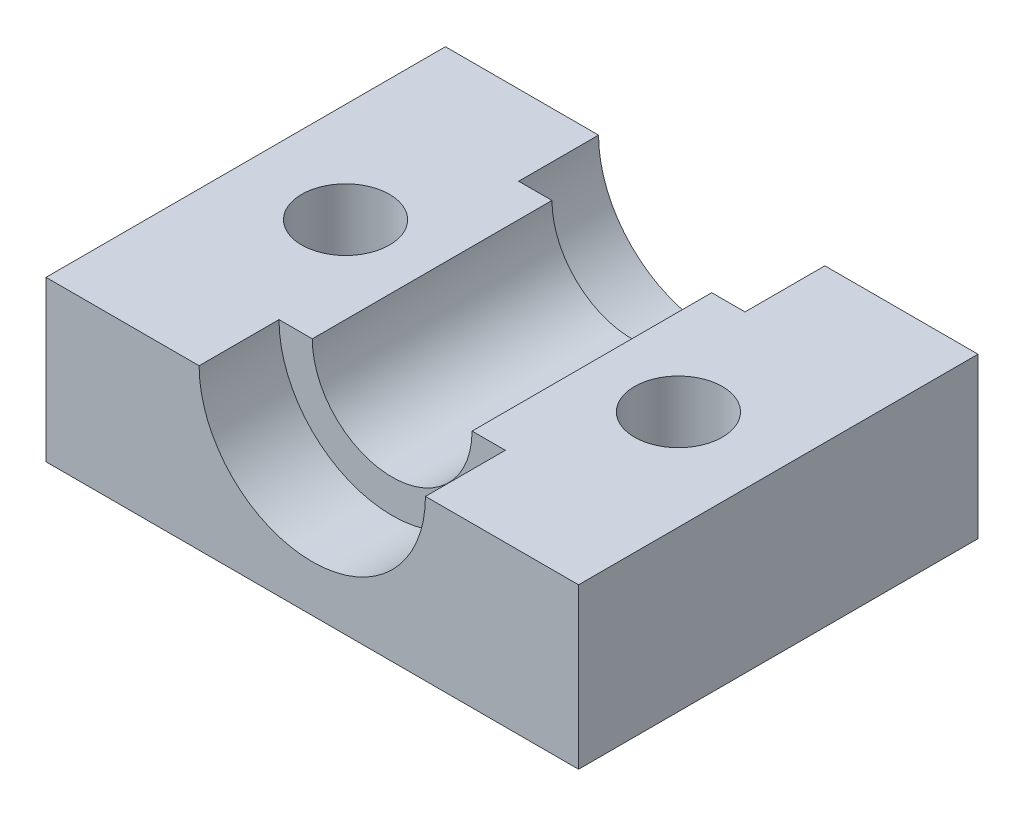
ISO-10303-21;
HEADER;
FILE_DESCRIPTION(('STEP AP214'),'2;1');
FILE_NAME('part.step','',(''),(''),'','','');
FILE_SCHEMA(('AUTOMOTIVE_DESIGN { 1 0 10303 214 1 1 1 1 }'));
ENDSEC;
DATA;
#1=APPLICATION_CONTEXT('core data for automotive mechanical design processes');
#2=APPLICATION_PROTOCOL_DEFINITION('international standard','automotive_design',2000,#1);
#3=PRODUCT_CONTEXT('',#1,'mechanical');
#4=PRODUCT('Part','Part','',(#3));
#5=PRODUCT_RELATED_PRODUCT_CATEGORY('part','',(#4));
#6=PRODUCT_DEFINITION_FORMATION('','',#4);
#7=PRODUCT_DEFINITION_CONTEXT('part definition',#1,'design');
#8=PRODUCT_DEFINITION('design','',#6,#7);
#9=PRODUCT_DEFINITION_SHAPE('','',#8);
#10=(LENGTH_UNIT() NAMED_UNIT(*) SI_UNIT(.MILLI.,.METRE.));
#11=(NAMED_UNIT(*) PLANE_ANGLE_UNIT() SI_UNIT($,.RADIAN.));
#12=(NAMED_UNIT(*) SI_UNIT($,.STERADIAN.) SOLID_ANGLE_UNIT());
#13=UNCERTAINTY_MEASURE_WITH_UNIT(LENGTH_MEASURE(1.E-05),#10,'distance_accuracy_value','');
#14=(GEOMETRIC_REPRESENTATION_CONTEXT(3) GLOBAL_UNCERTAINTY_ASSIGNED_CONTEXT((#13)) GLOBAL_UNIT_ASSIGNED_CONTEXT((#10,
#11,#12)) REPRESENTATION_CONTEXT('',''));
#15=CARTESIAN_POINT('',(0.,0.,0.));
#16=DIRECTION('',(0.,0.,1.));
#17=DIRECTION('',(1.,0.,0.));
#18=AXIS2_PLACEMENT_3D('',#15,#16,#17);
#19=CARTESIAN_POINT('',(20.,12.,-6.));
#20=DIRECTION('',(0.,0.,1.));
#21=DIRECTION('',(1.,0.,0.));
#22=AXIS2_PLACEMENT_3D('',#19,#20,#21);
#23=CYLINDRICAL_SURFACE('',#22,8.5);
#24=DIRECTION('',(0.,0.,1.));
#25=VECTOR('',#24,1.);
#26=CARTESIAN_POINT('',(11.5,12.,-6.));
#27=LINE('',#26,#25);
#28=CARTESIAN_POINT('',(11.5,12.,-6.));
#29=VERTEX_POINT('',#28);
#30=CARTESIAN_POINT('',(11.5,12.,0.));
#31=VERTEX_POINT('',#30);
#32=EDGE_CURVE('E46',#29,#31,#27,.T.);
#33=ORIENTED_EDGE('',*,*,#32,.T.);
#34=CARTESIAN_POINT('',(20.,12.,0.));
#35=DIRECTION('',(0.,0.,1.));
#36=DIRECTION('',(1.,0.,0.));
#37=AXIS2_PLACEMENT_3D('',#34,#35,#36);
#38=CIRCLE('',#37,8.5);
#39=CARTESIAN_POINT('',(28.5,12.,0.));
#40=VERTEX_POINT('',#39);
#41=EDGE_CURVE('E139',#31,#40,#38,.T.);
#42=ORIENTED_EDGE('',*,*,#41,.T.);
#43=DIRECTION('',(0.,0.,1.));
#44=VECTOR('',#43,1.);
#45=CARTESIAN_POINT('',(28.5,12.,-6.));
#46=LINE('',#45,#44);
#47=CARTESIAN_POINT('',(28.5,12.,-6.));
#48=VERTEX_POINT('',#47);
#49=EDGE_CURVE('E186',#48,#40,#46,.T.);
#50=ORIENTED_EDGE('',*,*,#49,.F.);
#51=CARTESIAN_POINT('',(20.,12.,-6.));
#52=DIRECTION('',(0.,0.,-1.));
#53=DIRECTION('',(1.,0.,0.));
#54=AXIS2_PLACEMENT_3D('',#51,#52,#53);
#55=CIRCLE('',#54,8.5);
#56=EDGE_CURVE('E177',#48,#29,#55,.T.);
#57=ORIENTED_EDGE('',*,*,#56,.T.);
#58=EDGE_LOOP('',(#33,#42,#50,#57));
#59=FACE_BOUND('',#58,.T.);
#60=ADVANCED_FACE('F37',(#59),#23,.F.);
#61=CARTESIAN_POINT('',(0.,0.,-6.));
#62=DIRECTION('',(-1.,0.,0.));
#63=DIRECTION('',(0.,0.,1.));
#64=AXIS2_PLACEMENT_3D('',#61,#62,#63);
#65=PLANE('',#64);
#66=DIRECTION('',(0.,0.,1.));
#67=VECTOR('',#66,1.);
#68=CARTESIAN_POINT('',(0.,0.,-6.));
#69=LINE('',#68,#67);
#70=CARTESIAN_POINT('',(0.,0.,-6.));
#71=VERTEX_POINT('',#70);
#72=CARTESIAN_POINT('',(0.,0.,24.));
#73=VERTEX_POINT('',#72);
#74=EDGE_CURVE('E41',#71,#73,#69,.T.);
#75=ORIENTED_EDGE('',*,*,#74,.T.);
#76=DIRECTION('',(0.,-1.,0.));
#77=VECTOR('',#76,1.);
#78=CARTESIAN_POINT('',(0.,0.,24.));
#79=LINE('',#78,#77);
#80=CARTESIAN_POINT('',(0.,12.,24.));
#81=VERTEX_POINT('',#80);
#82=EDGE_CURVE('E128',#81,#73,#79,.T.);
#83=ORIENTED_EDGE('',*,*,#82,.F.);
#84=DIRECTION('',(0.,0.,1.));
#85=VECTOR('',#84,1.);
#86=CARTESIAN_POINT('',(0.,12.,-6.));
#87=LINE('',#86,#85);
#88=CARTESIAN_POINT('',(0.,12.,-6.));
#89=VERTEX_POINT('',#88);
#90=EDGE_CURVE('E11',#89,#81,#87,.T.);
#91=ORIENTED_EDGE('',*,*,#90,.F.);
#92=DIRECTION('',(0.,-1.,0.));
#93=VECTOR('',#92,1.);
#94=CARTESIAN_POINT('',(0.,0.,-6.));
#95=LINE('',#94,#93);
#96=EDGE_CURVE('E166',#89,#71,#95,.T.);
#97=ORIENTED_EDGE('',*,*,#96,.T.);
#98=EDGE_LOOP('',(#75,#83,#91,#97));
#99=FACE_BOUND('',#98,.T.);
#100=ADVANCED_FACE('F39',(#99),#65,.T.);
#101=CARTESIAN_POINT('',(0.,12.,-6.));
#102=DIRECTION('',(0.,1.,0.));
#103=DIRECTION('',(0.,0.,1.));
#104=AXIS2_PLACEMENT_3D('',#101,#102,#103);
#105=PLANE('',#104);
#106=CARTESIAN_POINT('',(7.5,12.,9.));
#107=DIRECTION('',(0.,-1.,0.));
#108=DIRECTION('',(0.,0.,-1.));
#109=AXIS2_PLACEMENT_3D('',#106,#107,#108);
#110=CIRCLE('',#109,3.3);
#111=CARTESIAN_POINT('',(7.5,12.,5.7));
#112=VERTEX_POINT('',#111);
#113=EDGE_CURVE('E226',#112,#112,#110,.T.);
#114=ORIENTED_EDGE('',*,*,#113,.T.);
#115=EDGE_LOOP('',(#114));
#116=FACE_BOUND('',#115,.T.);
#117=ORIENTED_EDGE('',*,*,#90,.T.);
#118=DIRECTION('',(-1.,0.,0.));
#119=VECTOR('',#118,1.);
#120=CARTESIAN_POINT('',(0.,12.,24.));
#121=LINE('',#120,#119);
#122=CARTESIAN_POINT('',(11.5,12.,24.));
#123=VERTEX_POINT('',#122);
#124=EDGE_CURVE('E163',#123,#81,#121,.T.);
#125=ORIENTED_EDGE('',*,*,#124,.F.);
#126=CARTESIAN_POINT('',(11.5,12.,18.));
#127=VERTEX_POINT('',#126);
#128=EDGE_CURVE('E185',#127,#123,#27,.T.);
#129=ORIENTED_EDGE('',*,*,#128,.F.);
#130=DIRECTION('',(-1.,0.,0.));
#131=VECTOR('',#130,1.);
#132=CARTESIAN_POINT('',(11.5,12.,18.));
#133=LINE('',#132,#131);
#134=CARTESIAN_POINT('',(14.,12.,18.));
#135=VERTEX_POINT('',#134);
#136=EDGE_CURVE('E134',#135,#127,#133,.T.);
#137=ORIENTED_EDGE('',*,*,#136,.F.);
#138=DIRECTION('',(0.,0.,-1.));
#139=VECTOR('',#138,1.);
#140=CARTESIAN_POINT('',(14.,12.,18.));
#141=LINE('',#140,#139);
#142=CARTESIAN_POINT('',(14.,12.,0.));
#143=VERTEX_POINT('',#142);
#144=EDGE_CURVE('E129',#135,#143,#141,.T.);
#145=ORIENTED_EDGE('',*,*,#144,.T.);
#146=DIRECTION('',(-1.,0.,0.));
#147=VECTOR('',#146,1.);
#148=CARTESIAN_POINT('',(11.5,12.,0.));
#149=LINE('',#148,#147);
#150=EDGE_CURVE('E146',#143,#31,#149,.T.);
#151=ORIENTED_EDGE('',*,*,#150,.T.);
#152=ORIENTED_EDGE('',*,*,#32,.F.);
#153=DIRECTION('',(-1.,0.,0.));
#154=VECTOR('',#153,1.);
#155=CARTESIAN_POINT('',(0.,12.,-6.));
#156=LINE('',#155,#154);
#157=EDGE_CURVE('E180',#29,#89,#156,.T.);
#158=ORIENTED_EDGE('',*,*,#157,.T.);
#159=EDGE_LOOP('',(#117,#125,#129,#137,#145,#151,#152,#158));
#160=FACE_BOUND('',#159,.T.);
#161=ADVANCED_FACE('F202',(#116,#160),#105,.T.);
#162=CARTESIAN_POINT('',(20.,12.,18.));
#163=DIRECTION('',(0.,0.,1.));
#164=DIRECTION('',(1.,0.,0.));
#165=AXIS2_PLACEMENT_3D('',#162,#163,#164);
#166=CIRCLE('',#165,8.5);
#167=CARTESIAN_POINT('',(28.5,12.,18.));
#168=VERTEX_POINT('',#167);
#169=EDGE_CURVE('E54',#127,#168,#166,.T.);
#170=ORIENTED_EDGE('',*,*,#169,.F.);
#171=ORIENTED_EDGE('',*,*,#128,.T.);
#172=CARTESIAN_POINT('',(20.,12.,24.));
#173=DIRECTION('',(0.,0.,-1.));
#174=DIRECTION('',(1.,0.,0.));
#175=AXIS2_PLACEMENT_3D('',#172,#173,#174);
#176=CIRCLE('',#175,8.5);
#177=CARTESIAN_POINT('',(28.5,12.,24.));
#178=VERTEX_POINT('',#177);
#179=EDGE_CURVE('E160',#178,#123,#176,.T.);
#180=ORIENTED_EDGE('',*,*,#179,.F.);
#181=EDGE_CURVE('E188',#168,#178,#46,.T.);
#182=ORIENTED_EDGE('',*,*,#181,.F.);
#183=EDGE_LOOP('',(#170,#171,#180,#182));
#184=FACE_BOUND('',#183,.T.);
#185=ADVANCED_FACE('F213',(#184),#23,.F.);
#186=CARTESIAN_POINT('',(28.5,12.,-6.));
#187=DIRECTION('',(0.,1.,0.));
#188=DIRECTION('',(-1.,0.,0.));
#189=AXIS2_PLACEMENT_3D('',#186,#187,#188);
#190=PLANE('',#189);
#191=CARTESIAN_POINT('',(32.5,12.,9.00000000000001));
#192=DIRECTION('',(0.,-1.,0.));
#193=DIRECTION('',(0.,0.,-1.));
#194=AXIS2_PLACEMENT_3D('',#191,#192,#193);
#195=CIRCLE('',#194,3.3);
#196=CARTESIAN_POINT('',(32.5,12.,5.70000000000001));
#197=VERTEX_POINT('',#196);
#198=EDGE_CURVE('E142',#197,#197,#195,.T.);
#199=ORIENTED_EDGE('',*,*,#198,.T.);
#200=EDGE_LOOP('',(#199));
#201=FACE_BOUND('',#200,.T.);
#202=ORIENTED_EDGE('',*,*,#49,.T.);
#203=DIRECTION('',(-1.,0.,0.));
#204=VECTOR('',#203,1.);
#205=CARTESIAN_POINT('',(26.,12.,0.));
#206=LINE('',#205,#204);
#207=CARTESIAN_POINT('',(26.,12.,0.));
#208=VERTEX_POINT('',#207);
#209=EDGE_CURVE('E125',#40,#208,#206,.T.);
#210=ORIENTED_EDGE('',*,*,#209,.T.);
#211=DIRECTION('',(0.,0.,-1.));
#212=VECTOR('',#211,1.);
#213=CARTESIAN_POINT('',(26.,12.,18.));
#214=LINE('',#213,#212);
#215=CARTESIAN_POINT('',(26.,12.,18.));
#216=VERTEX_POINT('',#215);
#217=EDGE_CURVE('E122',#216,#208,#214,.T.);
#218=ORIENTED_EDGE('',*,*,#217,.F.);
#219=DIRECTION('',(-1.,0.,0.));
#220=VECTOR('',#219,1.);
#221=CARTESIAN_POINT('',(26.,12.,18.));
#222=LINE('',#221,#220);
#223=EDGE_CURVE('E112',#168,#216,#222,.T.);
#224=ORIENTED_EDGE('',*,*,#223,.F.);
#225=ORIENTED_EDGE('',*,*,#181,.T.);
#226=DIRECTION('',(-1.,0.,0.));
#227=VECTOR('',#226,1.);
#228=CARTESIAN_POINT('',(28.5,12.,24.));
#229=LINE('',#228,#227);
#230=CARTESIAN_POINT('',(40.,12.,24.));
#231=VERTEX_POINT('',#230);
#232=EDGE_CURVE('E157',#231,#178,#229,.T.);
#233=ORIENTED_EDGE('',*,*,#232,.F.);
#234=DIRECTION('',(0.,0.,1.));
#235=VECTOR('',#234,1.);
#236=CARTESIAN_POINT('',(40.,12.,-6.));
#237=LINE('',#236,#235);
#238=CARTESIAN_POINT('',(40.,12.,-6.));
#239=VERTEX_POINT('',#238);
#240=EDGE_CURVE('E189',#239,#231,#237,.T.);
#241=ORIENTED_EDGE('',*,*,#240,.F.);
#242=DIRECTION('',(-1.,0.,0.));
#243=VECTOR('',#242,1.);
#244=CARTESIAN_POINT('',(28.5,12.,-6.));
#245=LINE('',#244,#243);
#246=EDGE_CURVE('E174',#239,#48,#245,.T.);
#247=ORIENTED_EDGE('',*,*,#246,.T.);
#248=EDGE_LOOP('',(#202,#210,#218,#224,#225,#233,#241,#247));
#249=FACE_BOUND('',#248,.T.);
#250=ADVANCED_FACE('F124',(#201,#249),#190,.T.);
#251=CARTESIAN_POINT('',(40.,0.,-6.));
#252=DIRECTION('',(1.,0.,0.));
#253=DIRECTION('',(0.,1.,0.));
#254=AXIS2_PLACEMENT_3D('',#251,#252,#253);
#255=PLANE('',#254);
#256=ORIENTED_EDGE('',*,*,#240,.T.);
#257=DIRECTION('',(0.,1.,0.));
#258=VECTOR('',#257,1.);
#259=CARTESIAN_POINT('',(40.,0.,24.));
#260=LINE('',#259,#258);
#261=CARTESIAN_POINT('',(40.,0.,24.));
#262=VERTEX_POINT('',#261);
#263=EDGE_CURVE('E154',#262,#231,#260,.T.);
#264=ORIENTED_EDGE('',*,*,#263,.F.);
#265=DIRECTION('',(0.,0.,1.));
#266=VECTOR('',#265,1.);
#267=CARTESIAN_POINT('',(40.,0.,-6.));
#268=LINE('',#267,#266);
#269=CARTESIAN_POINT('',(40.,0.,-6.));
#270=VERTEX_POINT('',#269);
#271=EDGE_CURVE('E190',#270,#262,#268,.T.);
#272=ORIENTED_EDGE('',*,*,#271,.F.);
#273=DIRECTION('',(0.,1.,0.));
#274=VECTOR('',#273,1.);
#275=CARTESIAN_POINT('',(40.,0.,-6.));
#276=LINE('',#275,#274);
#277=EDGE_CURVE('E171',#270,#239,#276,.T.);
#278=ORIENTED_EDGE('',*,*,#277,.T.);
#279=EDGE_LOOP('',(#256,#264,#272,#278));
#280=FACE_BOUND('',#279,.T.);
#281=ADVANCED_FACE('F210',(#280),#255,.T.);
#282=CARTESIAN_POINT('',(0.,0.,-6.));
#283=DIRECTION('',(0.,-1.,0.));
#284=DIRECTION('',(1.,0.,0.));
#285=AXIS2_PLACEMENT_3D('',#282,#283,#284);
#286=PLANE('',#285);
#287=CARTESIAN_POINT('',(7.5,0.,9.));
#288=DIRECTION('',(0.,-1.,0.));
#289=DIRECTION('',(0.,0.,-1.));
#290=AXIS2_PLACEMENT_3D('',#287,#288,#289);
#291=CIRCLE('',#290,5.5);
#292=CARTESIAN_POINT('',(7.5,0.,3.5));
#293=VERTEX_POINT('',#292);
#294=EDGE_CURVE('E235',#293,#293,#291,.T.);
#295=ORIENTED_EDGE('',*,*,#294,.F.);
#296=EDGE_LOOP('',(#295));
#297=FACE_BOUND('',#296,.T.);
#298=CARTESIAN_POINT('',(32.5,0.,9.00000000000001));
#299=DIRECTION('',(0.,-1.,0.));
#300=DIRECTION('',(0.,0.,-1.));
#301=AXIS2_PLACEMENT_3D('',#298,#299,#300);
#302=CIRCLE('',#301,5.5);
#303=CARTESIAN_POINT('',(32.5,0.,3.50000000000001));
#304=VERTEX_POINT('',#303);
#305=EDGE_CURVE('E223',#304,#304,#302,.T.);
#306=ORIENTED_EDGE('',*,*,#305,.F.);
#307=EDGE_LOOP('',(#306));
#308=FACE_BOUND('',#307,.T.);
#309=ORIENTED_EDGE('',*,*,#271,.T.);
#310=DIRECTION('',(1.,0.,0.));
#311=VECTOR('',#310,1.);
#312=CARTESIAN_POINT('',(0.,0.,24.));
#313=LINE('',#312,#311);
#314=EDGE_CURVE('E151',#73,#262,#313,.T.);
#315=ORIENTED_EDGE('',*,*,#314,.F.);
#316=ORIENTED_EDGE('',*,*,#74,.F.);
#317=DIRECTION('',(1.,0.,0.));
#318=VECTOR('',#317,1.);
#319=CARTESIAN_POINT('',(0.,0.,-6.));
#320=LINE('',#319,#318);
#321=EDGE_CURVE('E168',#71,#270,#320,.T.);
#322=ORIENTED_EDGE('',*,*,#321,.T.);
#323=EDGE_LOOP('',(#309,#315,#316,#322));
#324=FACE_BOUND('',#323,.T.);
#325=ADVANCED_FACE('F194',(#297,#308,#324),#286,.T.);
#326=CARTESIAN_POINT('',(20.,12.,-6.));
#327=DIRECTION('',(0.,0.,1.));
#328=DIRECTION('',(1.,0.,0.));
#329=AXIS2_PLACEMENT_3D('',#326,#327,#328);
#330=PLANE('',#329);
#331=ORIENTED_EDGE('',*,*,#96,.F.);
#332=ORIENTED_EDGE('',*,*,#157,.F.);
#333=ORIENTED_EDGE('',*,*,#56,.F.);
#334=ORIENTED_EDGE('',*,*,#246,.F.);
#335=ORIENTED_EDGE('',*,*,#277,.F.);
#336=ORIENTED_EDGE('',*,*,#321,.F.);
#337=EDGE_LOOP('',(#331,#332,#333,#334,#335,#336));
#338=FACE_BOUND('',#337,.T.);
#339=ADVANCED_FACE('F206',(#338),#330,.F.);
#340=CARTESIAN_POINT('',(20.,12.,24.));
#341=DIRECTION('',(0.,0.,1.));
#342=DIRECTION('',(1.,0.,0.));
#343=AXIS2_PLACEMENT_3D('',#340,#341,#342);
#344=PLANE('',#343);
#345=ORIENTED_EDGE('',*,*,#82,.T.);
#346=ORIENTED_EDGE('',*,*,#314,.T.);
#347=ORIENTED_EDGE('',*,*,#263,.T.);
#348=ORIENTED_EDGE('',*,*,#232,.T.);
#349=ORIENTED_EDGE('',*,*,#179,.T.);
#350=ORIENTED_EDGE('',*,*,#124,.T.);
#351=EDGE_LOOP('',(#345,#346,#347,#348,#349,#350));
#352=FACE_BOUND('',#351,.T.);
#353=ADVANCED_FACE('F197',(#352),#344,.T.);
#354=CARTESIAN_POINT('',(20.,12.,18.));
#355=DIRECTION('',(0.,0.,-1.));
#356=DIRECTION('',(-1.,0.,0.));
#357=AXIS2_PLACEMENT_3D('',#354,#355,#356);
#358=CYLINDRICAL_SURFACE('',#357,6.);
#359=CARTESIAN_POINT('',(20.,12.,0.));
#360=DIRECTION('',(0.,0.,-1.));
#361=DIRECTION('',(1.,0.,0.));
#362=AXIS2_PLACEMENT_3D('',#359,#360,#361);
#363=CIRCLE('',#362,6.);
#364=EDGE_CURVE('E144',#208,#143,#363,.T.);
#365=ORIENTED_EDGE('',*,*,#364,.T.);
#366=ORIENTED_EDGE('',*,*,#144,.F.);
#367=CARTESIAN_POINT('',(20.,12.,18.));
#368=DIRECTION('',(0.,0.,-1.));
#369=DIRECTION('',(1.,0.,0.));
#370=AXIS2_PLACEMENT_3D('',#367,#368,#369);
#371=CIRCLE('',#370,6.);
#372=EDGE_CURVE('E116',#216,#135,#371,.T.);
#373=ORIENTED_EDGE('',*,*,#372,.F.);
#374=ORIENTED_EDGE('',*,*,#217,.T.);
#375=EDGE_LOOP('',(#365,#366,#373,#374));
#376=FACE_BOUND('',#375,.T.);
#377=ADVANCED_FACE('F131',(#376),#358,.F.);
#378=CARTESIAN_POINT('',(20.,12.,18.));
#379=DIRECTION('',(0.,0.,1.));
#380=DIRECTION('',(1.,0.,0.));
#381=AXIS2_PLACEMENT_3D('',#378,#379,#380);
#382=PLANE('',#381);
#383=ORIENTED_EDGE('',*,*,#169,.T.);
#384=ORIENTED_EDGE('',*,*,#223,.T.);
#385=ORIENTED_EDGE('',*,*,#372,.T.);
#386=ORIENTED_EDGE('',*,*,#136,.T.);
#387=EDGE_LOOP('',(#383,#384,#385,#386));
#388=FACE_BOUND('',#387,.T.);
#389=ADVANCED_FACE('F114',(#388),#382,.T.);
#390=CARTESIAN_POINT('',(20.,12.,0.));
#391=DIRECTION('',(0.,0.,1.));
#392=DIRECTION('',(1.,0.,0.));
#393=AXIS2_PLACEMENT_3D('',#390,#391,#392);
#394=PLANE('',#393);
#395=ORIENTED_EDGE('',*,*,#41,.F.);
#396=ORIENTED_EDGE('',*,*,#150,.F.);
#397=ORIENTED_EDGE('',*,*,#364,.F.);
#398=ORIENTED_EDGE('',*,*,#209,.F.);
#399=EDGE_LOOP('',(#395,#396,#397,#398));
#400=FACE_BOUND('',#399,.T.);
#401=ADVANCED_FACE('F286',(#400),#394,.F.);
#402=CARTESIAN_POINT('',(32.5,0.,9.00000000000001));
#403=DIRECTION('',(0.,-1.,0.));
#404=DIRECTION('',(0.,0.,-1.));
#405=AXIS2_PLACEMENT_3D('',#402,#403,#404);
#406=CYLINDRICAL_SURFACE('',#405,3.3);
#407=ORIENTED_EDGE('',*,*,#198,.F.);
#408=EDGE_LOOP('',(#407));
#409=FACE_BOUND('',#408,.T.);
#410=CARTESIAN_POINT('',(32.5,6.40000000000001,9.00000000000001));
#411=DIRECTION('',(0.,-1.,0.));
#412=DIRECTION('',(0.,0.,-1.));
#413=AXIS2_PLACEMENT_3D('',#410,#411,#412);
#414=CIRCLE('',#413,3.3);
#415=CARTESIAN_POINT('',(32.5,6.40000000000001,5.70000000000001));
#416=VERTEX_POINT('',#415);
#417=EDGE_CURVE('E217',#416,#416,#414,.T.);
#418=ORIENTED_EDGE('',*,*,#417,.T.);
#419=EDGE_LOOP('',(#418));
#420=FACE_BOUND('',#419,.T.);
#421=ADVANCED_FACE('F258',(#409,#420),#406,.F.);
#422=CARTESIAN_POINT('',(35.8,6.40000000000001,9.00000000000001));
#423=DIRECTION('',(0.,1.,0.));
#424=DIRECTION('',(0.,0.,1.));
#425=AXIS2_PLACEMENT_3D('',#422,#423,#424);
#426=PLANE('',#425);
#427=ORIENTED_EDGE('',*,*,#417,.F.);
#428=EDGE_LOOP('',(#427));
#429=FACE_BOUND('',#428,.T.);
#430=CARTESIAN_POINT('',(32.5,6.40000000000001,9.00000000000001));
#431=DIRECTION('',(0.,-1.,0.));
#432=DIRECTION('',(0.,0.,-1.));
#433=AXIS2_PLACEMENT_3D('',#430,#431,#432);
#434=CIRCLE('',#433,5.5);
#435=CARTESIAN_POINT('',(32.5,6.40000000000001,3.50000000000001));
#436=VERTEX_POINT('',#435);
#437=EDGE_CURVE('E220',#436,#436,#434,.T.);
#438=ORIENTED_EDGE('',*,*,#437,.T.);
#439=EDGE_LOOP('',(#438));
#440=FACE_BOUND('',#439,.T.);
#441=ADVANCED_FACE('F248',(#429,#440),#426,.F.);
#442=CARTESIAN_POINT('',(32.5,0.,9.00000000000001));
#443=DIRECTION('',(0.,-1.,0.));
#444=DIRECTION('',(0.,0.,-1.));
#445=AXIS2_PLACEMENT_3D('',#442,#443,#444);
#446=CYLINDRICAL_SURFACE('',#445,5.5);
#447=ORIENTED_EDGE('',*,*,#437,.F.);
#448=EDGE_LOOP('',(#447));
#449=FACE_BOUND('',#448,.T.);
#450=ORIENTED_EDGE('',*,*,#305,.T.);
#451=EDGE_LOOP('',(#450));
#452=FACE_BOUND('',#451,.T.);
#453=ADVANCED_FACE('F245',(#449,#452),#446,.F.);
#454=CARTESIAN_POINT('',(7.5,0.,9.));
#455=DIRECTION('',(0.,-1.,0.));
#456=DIRECTION('',(0.,0.,-1.));
#457=AXIS2_PLACEMENT_3D('',#454,#455,#456);
#458=CYLINDRICAL_SURFACE('',#457,3.3);
#459=ORIENTED_EDGE('',*,*,#113,.F.);
#460=EDGE_LOOP('',(#459));
#461=FACE_BOUND('',#460,.T.);
#462=CARTESIAN_POINT('',(7.5,6.4,9.));
#463=DIRECTION('',(0.,-1.,0.));
#464=DIRECTION('',(0.,0.,-1.));
#465=AXIS2_PLACEMENT_3D('',#462,#463,#464);
#466=CIRCLE('',#465,3.3);
#467=CARTESIAN_POINT('',(7.5,6.4,5.7));
#468=VERTEX_POINT('',#467);
#469=EDGE_CURVE('E229',#468,#468,#466,.T.);
#470=ORIENTED_EDGE('',*,*,#469,.T.);
#471=EDGE_LOOP('',(#470));
#472=FACE_BOUND('',#471,.T.);
#473=ADVANCED_FACE('F247',(#461,#472),#458,.F.);
#474=CARTESIAN_POINT('',(10.8,6.4,9.));
#475=DIRECTION('',(0.,1.,0.));
#476=DIRECTION('',(0.,0.,1.));
#477=AXIS2_PLACEMENT_3D('',#474,#475,#476);
#478=PLANE('',#477);
#479=ORIENTED_EDGE('',*,*,#469,.F.);
#480=EDGE_LOOP('',(#479));
#481=FACE_BOUND('',#480,.T.);
#482=CARTESIAN_POINT('',(7.5,6.4,9.));
#483=DIRECTION('',(0.,-1.,0.));
#484=DIRECTION('',(0.,0.,-1.));
#485=AXIS2_PLACEMENT_3D('',#482,#483,#484);
#486=CIRCLE('',#485,5.5);
#487=CARTESIAN_POINT('',(7.5,6.4,3.5));
#488=VERTEX_POINT('',#487);
#489=EDGE_CURVE('E232',#488,#488,#486,.T.);
#490=ORIENTED_EDGE('',*,*,#489,.T.);
#491=EDGE_LOOP('',(#490));
#492=FACE_BOUND('',#491,.T.);
#493=ADVANCED_FACE('F255',(#481,#492),#478,.F.);
#494=CARTESIAN_POINT('',(7.5,0.,9.));
#495=DIRECTION('',(0.,-1.,0.));
#496=DIRECTION('',(0.,0.,-1.));
#497=AXIS2_PLACEMENT_3D('',#494,#495,#496);
#498=CYLINDRICAL_SURFACE('',#497,5.5);
#499=ORIENTED_EDGE('',*,*,#489,.F.);
#500=EDGE_LOOP('',(#499));
#501=FACE_BOUND('',#500,.T.);
#502=ORIENTED_EDGE('',*,*,#294,.T.);
#503=EDGE_LOOP('',(#502));
#504=FACE_BOUND('',#503,.T.);
#505=ADVANCED_FACE('F239',(#501,#504),#498,.F.);
#506=CLOSED_SHELL('',(#60,#100,#161,#185,#250,#281,#325,#339,#353,#377,#389,#401,#421,#441,#453,
#473,#493,#505));
#507=MANIFOLD_SOLID_BREP('B2',#506);
#508=ADVANCED_BREP_SHAPE_REPRESENTATION('',(#18,#507),#14);
#509=SHAPE_DEFINITION_REPRESENTATION(#9,#508);
ENDSEC;
END-ISO-10303-21;
